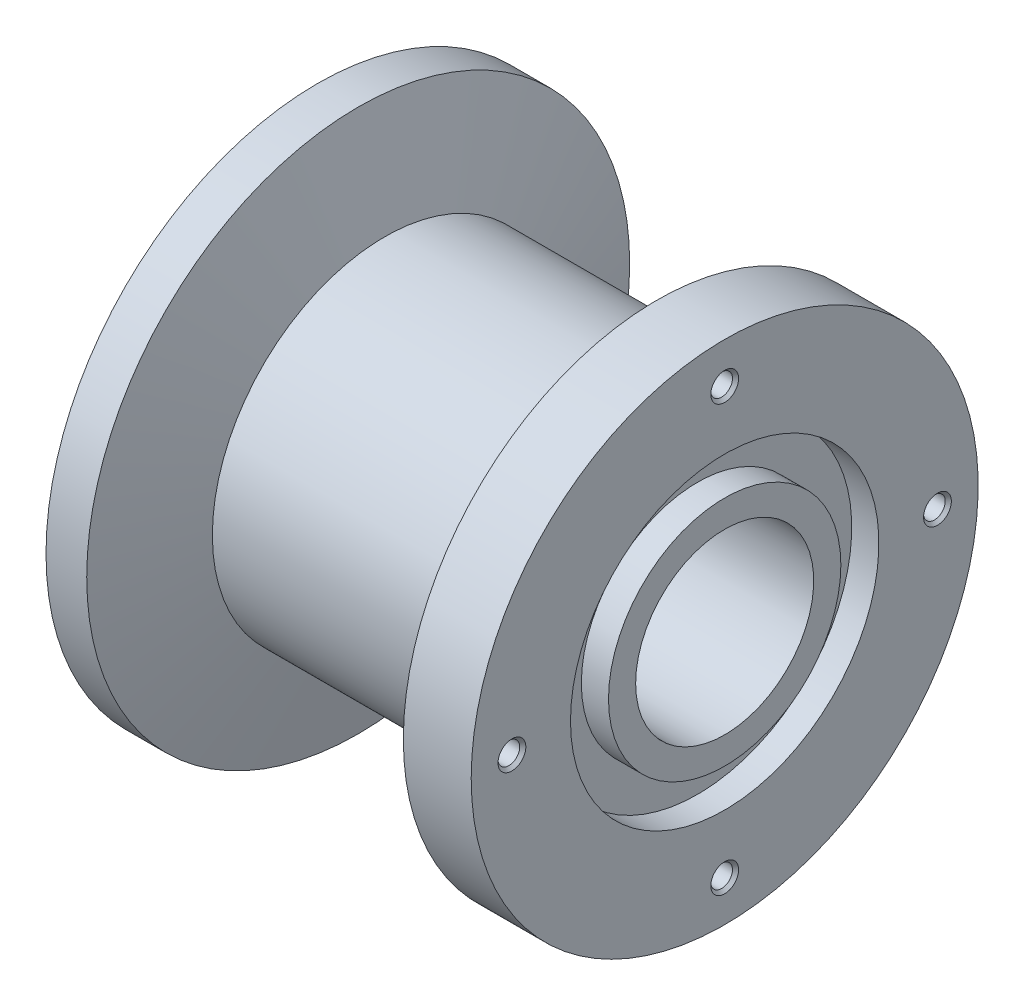
ISO-10303-21;
HEADER;
FILE_DESCRIPTION(('STEP AP214'),'2;1');
FILE_NAME('part.step','',(''),(''),'','','');
FILE_SCHEMA(('AUTOMOTIVE_DESIGN { 1 0 10303 214 1 1 1 1 }'));
ENDSEC;
DATA;
#1=APPLICATION_CONTEXT('core data for automotive mechanical design processes');
#2=APPLICATION_PROTOCOL_DEFINITION('international standard','automotive_design',2000,#1);
#3=PRODUCT_CONTEXT('',#1,'mechanical');
#4=PRODUCT('Part','Part','',(#3));
#5=PRODUCT_RELATED_PRODUCT_CATEGORY('part','',(#4));
#6=PRODUCT_DEFINITION_FORMATION('','',#4);
#7=PRODUCT_DEFINITION_CONTEXT('part definition',#1,'design');
#8=PRODUCT_DEFINITION('design','',#6,#7);
#9=PRODUCT_DEFINITION_SHAPE('','',#8);
#10=(LENGTH_UNIT() NAMED_UNIT(*) SI_UNIT(.MILLI.,.METRE.));
#11=(NAMED_UNIT(*) PLANE_ANGLE_UNIT() SI_UNIT($,.RADIAN.));
#12=(NAMED_UNIT(*) SI_UNIT($,.STERADIAN.) SOLID_ANGLE_UNIT());
#13=UNCERTAINTY_MEASURE_WITH_UNIT(LENGTH_MEASURE(1.E-05),#10,'distance_accuracy_value','');
#14=(GEOMETRIC_REPRESENTATION_CONTEXT(3) GLOBAL_UNCERTAINTY_ASSIGNED_CONTEXT((#13)) GLOBAL_UNIT_ASSIGNED_CONTEXT((#10,
#11,#12)) REPRESENTATION_CONTEXT('',''));
#15=CARTESIAN_POINT('',(0.,0.,0.));
#16=DIRECTION('',(0.,0.,1.));
#17=DIRECTION('',(1.,0.,0.));
#18=AXIS2_PLACEMENT_3D('',#15,#16,#17);
#19=CARTESIAN_POINT('',(-29.0412384639782,0.,0.));
#20=DIRECTION('',(-1.,0.,0.));
#21=DIRECTION('',(0.,0.,1.));
#22=AXIS2_PLACEMENT_3D('',#19,#20,#21);
#23=CYLINDRICAL_SURFACE('',#22,20.);
#24=CARTESIAN_POINT('',(0.,0.,0.));
#25=DIRECTION('',(-1.,0.,0.));
#26=DIRECTION('',(0.,0.,1.));
#27=AXIS2_PLACEMENT_3D('',#24,#25,#26);
#28=CIRCLE('',#27,20.);
#29=CARTESIAN_POINT('',(0.,0.,20.));
#30=VERTEX_POINT('',#29);
#31=EDGE_CURVE('E10',#30,#30,#28,.T.);
#32=ORIENTED_EDGE('',*,*,#31,.F.);
#33=EDGE_LOOP('',(#32));
#34=FACE_BOUND('',#33,.T.);
#35=CARTESIAN_POINT('',(3.,0.,0.));
#36=DIRECTION('',(-1.,0.,0.));
#37=DIRECTION('',(0.,0.,1.));
#38=AXIS2_PLACEMENT_3D('',#35,#36,#37);
#39=CIRCLE('',#38,20.);
#40=CARTESIAN_POINT('',(3.,0.,20.));
#41=VERTEX_POINT('',#40);
#42=EDGE_CURVE('E83',#41,#41,#39,.T.);
#43=ORIENTED_EDGE('',*,*,#42,.T.);
#44=EDGE_LOOP('',(#43));
#45=FACE_BOUND('',#44,.T.);
#46=ADVANCED_FACE('F37',(#34,#45),#23,.T.);
#47=CARTESIAN_POINT('',(0.,20.,0.));
#48=DIRECTION('',(1.,0.,0.));
#49=DIRECTION('',(0.,0.,-1.));
#50=AXIS2_PLACEMENT_3D('',#47,#48,#49);
#51=PLANE('',#50);
#52=CARTESIAN_POINT('',(0.,0.,0.));
#53=DIRECTION('',(-1.,0.,0.));
#54=DIRECTION('',(0.,0.,1.));
#55=AXIS2_PLACEMENT_3D('',#52,#53,#54);
#56=CIRCLE('',#55,13.2);
#57=CARTESIAN_POINT('',(0.,0.,13.2));
#58=VERTEX_POINT('',#57);
#59=EDGE_CURVE('E43',#58,#58,#56,.T.);
#60=ORIENTED_EDGE('',*,*,#59,.F.);
#61=EDGE_LOOP('',(#60));
#62=FACE_BOUND('',#61,.T.);
#63=ORIENTED_EDGE('',*,*,#31,.T.);
#64=EDGE_LOOP('',(#63));
#65=FACE_BOUND('',#64,.T.);
#66=ADVANCED_FACE('F178',(#62,#65),#51,.F.);
#67=CARTESIAN_POINT('',(-29.0412384639782,0.,0.));
#68=DIRECTION('',(-1.,0.,0.));
#69=DIRECTION('',(0.,0.,1.));
#70=AXIS2_PLACEMENT_3D('',#67,#68,#69);
#71=CYLINDRICAL_SURFACE('',#70,13.2);
#72=CARTESIAN_POINT('',(2.7,0.,0.));
#73=DIRECTION('',(-1.,0.,0.));
#74=DIRECTION('',(0.,0.,1.));
#75=AXIS2_PLACEMENT_3D('',#72,#73,#74);
#76=CIRCLE('',#75,13.2);
#77=CARTESIAN_POINT('',(2.7,0.,13.2));
#78=VERTEX_POINT('',#77);
#79=EDGE_CURVE('E47',#78,#78,#76,.T.);
#80=ORIENTED_EDGE('',*,*,#79,.F.);
#81=EDGE_LOOP('',(#80));
#82=FACE_BOUND('',#81,.T.);
#83=ORIENTED_EDGE('',*,*,#59,.T.);
#84=EDGE_LOOP('',(#83));
#85=FACE_BOUND('',#84,.T.);
#86=ADVANCED_FACE('F173',(#82,#85),#71,.F.);
#87=CARTESIAN_POINT('',(2.7,13.2,0.));
#88=DIRECTION('',(1.,0.,0.));
#89=DIRECTION('',(0.,0.,-1.));
#90=AXIS2_PLACEMENT_3D('',#87,#88,#89);
#91=PLANE('',#90);
#92=CARTESIAN_POINT('',(2.7,0.,0.));
#93=DIRECTION('',(-1.,0.,0.));
#94=DIRECTION('',(0.,0.,1.));
#95=AXIS2_PLACEMENT_3D('',#92,#93,#94);
#96=CIRCLE('',#95,6.56);
#97=CARTESIAN_POINT('',(2.7,0.,6.56));
#98=VERTEX_POINT('',#97);
#99=EDGE_CURVE('E51',#98,#98,#96,.T.);
#100=ORIENTED_EDGE('',*,*,#99,.F.);
#101=EDGE_LOOP('',(#100));
#102=FACE_BOUND('',#101,.T.);
#103=ORIENTED_EDGE('',*,*,#79,.T.);
#104=EDGE_LOOP('',(#103));
#105=FACE_BOUND('',#104,.T.);
#106=ADVANCED_FACE('F167',(#102,#105),#91,.F.);
#107=CARTESIAN_POINT('',(-29.0412384639782,0.,0.));
#108=DIRECTION('',(-1.,0.,0.));
#109=DIRECTION('',(0.,0.,1.));
#110=AXIS2_PLACEMENT_3D('',#107,#108,#109);
#111=CYLINDRICAL_SURFACE('',#110,6.56);
#112=CARTESIAN_POINT('',(30.,0.,0.));
#113=DIRECTION('',(-1.,0.,0.));
#114=DIRECTION('',(0.,0.,1.));
#115=AXIS2_PLACEMENT_3D('',#112,#113,#114);
#116=CIRCLE('',#115,6.56);
#117=CARTESIAN_POINT('',(30.,0.,6.56));
#118=VERTEX_POINT('',#117);
#119=EDGE_CURVE('E56',#118,#118,#116,.T.);
#120=ORIENTED_EDGE('',*,*,#119,.F.);
#121=EDGE_LOOP('',(#120));
#122=FACE_BOUND('',#121,.T.);
#123=ORIENTED_EDGE('',*,*,#99,.T.);
#124=EDGE_LOOP('',(#123));
#125=FACE_BOUND('',#124,.T.);
#126=ADVANCED_FACE('F161',(#122,#125),#111,.F.);
#127=CARTESIAN_POINT('',(30.,6.56,0.));
#128=DIRECTION('',(-1.,0.,0.));
#129=DIRECTION('',(0.,0.,1.));
#130=AXIS2_PLACEMENT_3D('',#127,#128,#129);
#131=PLANE('',#130);
#132=CARTESIAN_POINT('',(30.,0.,0.));
#133=DIRECTION('',(-1.,0.,0.));
#134=DIRECTION('',(0.,0.,1.));
#135=AXIS2_PLACEMENT_3D('',#132,#133,#134);
#136=CIRCLE('',#135,8.56);
#137=CARTESIAN_POINT('',(30.,0.,8.56));
#138=VERTEX_POINT('',#137);
#139=EDGE_CURVE('E59',#138,#138,#136,.T.);
#140=ORIENTED_EDGE('',*,*,#139,.F.);
#141=EDGE_LOOP('',(#140));
#142=FACE_BOUND('',#141,.T.);
#143=ORIENTED_EDGE('',*,*,#119,.T.);
#144=EDGE_LOOP('',(#143));
#145=FACE_BOUND('',#144,.T.);
#146=ADVANCED_FACE('F155',(#142,#145),#131,.F.);
#147=CARTESIAN_POINT('',(-29.0412384639782,0.,0.));
#148=DIRECTION('',(-1.,0.,0.));
#149=DIRECTION('',(0.,0.,1.));
#150=AXIS2_PLACEMENT_3D('',#147,#148,#149);
#151=CYLINDRICAL_SURFACE('',#150,8.56);
#152=CARTESIAN_POINT('',(28.,0.,0.));
#153=DIRECTION('',(-1.,0.,0.));
#154=DIRECTION('',(0.,0.,1.));
#155=AXIS2_PLACEMENT_3D('',#152,#153,#154);
#156=CIRCLE('',#155,8.56);
#157=CARTESIAN_POINT('',(28.,0.,8.56));
#158=VERTEX_POINT('',#157);
#159=EDGE_CURVE('E62',#158,#158,#156,.T.);
#160=ORIENTED_EDGE('',*,*,#159,.F.);
#161=EDGE_LOOP('',(#160));
#162=FACE_BOUND('',#161,.T.);
#163=ORIENTED_EDGE('',*,*,#139,.T.);
#164=EDGE_LOOP('',(#163));
#165=FACE_BOUND('',#164,.T.);
#166=ADVANCED_FACE('F149',(#162,#165),#151,.T.);
#167=CARTESIAN_POINT('',(28.,8.56,0.));
#168=DIRECTION('',(-1.,0.,0.));
#169=DIRECTION('',(0.,0.,1.));
#170=AXIS2_PLACEMENT_3D('',#167,#168,#169);
#171=PLANE('',#170);
#172=CARTESIAN_POINT('',(28.,0.,0.));
#173=DIRECTION('',(-1.,0.,0.));
#174=DIRECTION('',(0.,0.,1.));
#175=AXIS2_PLACEMENT_3D('',#172,#173,#174);
#176=CIRCLE('',#175,11.36);
#177=CARTESIAN_POINT('',(28.,0.,11.36));
#178=VERTEX_POINT('',#177);
#179=EDGE_CURVE('E65',#178,#178,#176,.T.);
#180=ORIENTED_EDGE('',*,*,#179,.F.);
#181=EDGE_LOOP('',(#180));
#182=FACE_BOUND('',#181,.T.);
#183=ORIENTED_EDGE('',*,*,#159,.T.);
#184=EDGE_LOOP('',(#183));
#185=FACE_BOUND('',#184,.T.);
#186=ADVANCED_FACE('F143',(#182,#185),#171,.F.);
#187=CARTESIAN_POINT('',(-29.0412384639782,0.,0.));
#188=DIRECTION('',(-1.,0.,0.));
#189=DIRECTION('',(0.,0.,1.));
#190=AXIS2_PLACEMENT_3D('',#187,#188,#189);
#191=CYLINDRICAL_SURFACE('',#190,11.36);
#192=CARTESIAN_POINT('',(30.,0.,0.));
#193=DIRECTION('',(-1.,0.,0.));
#194=DIRECTION('',(0.,0.,1.));
#195=AXIS2_PLACEMENT_3D('',#192,#193,#194);
#196=CIRCLE('',#195,11.36);
#197=CARTESIAN_POINT('',(30.,0.,11.36));
#198=VERTEX_POINT('',#197);
#199=EDGE_CURVE('E68',#198,#198,#196,.T.);
#200=ORIENTED_EDGE('',*,*,#199,.F.);
#201=EDGE_LOOP('',(#200));
#202=FACE_BOUND('',#201,.T.);
#203=ORIENTED_EDGE('',*,*,#179,.T.);
#204=EDGE_LOOP('',(#203));
#205=FACE_BOUND('',#204,.T.);
#206=ADVANCED_FACE('F129',(#202,#205),#191,.F.);
#207=CARTESIAN_POINT('',(30.,11.36,0.));
#208=DIRECTION('',(-1.,0.,0.));
#209=DIRECTION('',(0.,0.,1.));
#210=AXIS2_PLACEMENT_3D('',#207,#208,#209);
#211=PLANE('',#210);
#212=CARTESIAN_POINT('',(30.,-15.675,0.));
#213=DIRECTION('',(1.,0.,0.));
#214=DIRECTION('',(0.,0.,1.));
#215=AXIS2_PLACEMENT_3D('',#212,#213,#214);
#216=CIRCLE('',#215,1.025);
#217=CARTESIAN_POINT('',(30.,-15.675,1.025));
#218=VERTEX_POINT('',#217);
#219=EDGE_CURVE('E108',#218,#218,#216,.T.);
#220=ORIENTED_EDGE('',*,*,#219,.F.);
#221=EDGE_LOOP('',(#220));
#222=FACE_BOUND('',#221,.T.);
#223=CARTESIAN_POINT('',(30.,1.64186909959098E-13,-15.675));
#224=DIRECTION('',(1.,0.,0.));
#225=DIRECTION('',(0.,-1.,0.));
#226=AXIS2_PLACEMENT_3D('',#223,#224,#225);
#227=CIRCLE('',#226,1.025);
#228=CARTESIAN_POINT('',(30.,-1.02499999999983,-15.675));
#229=VERTEX_POINT('',#228);
#230=EDGE_CURVE('E112',#229,#229,#227,.T.);
#231=ORIENTED_EDGE('',*,*,#230,.F.);
#232=EDGE_LOOP('',(#231));
#233=FACE_BOUND('',#232,.T.);
#234=CARTESIAN_POINT('',(30.,0.,15.675));
#235=DIRECTION('',(1.,0.,0.));
#236=DIRECTION('',(0.,1.,0.));
#237=AXIS2_PLACEMENT_3D('',#234,#235,#236);
#238=CIRCLE('',#237,1.025);
#239=CARTESIAN_POINT('',(30.,1.02499999999994,15.675));
#240=VERTEX_POINT('',#239);
#241=EDGE_CURVE('E101',#240,#240,#238,.T.);
#242=ORIENTED_EDGE('',*,*,#241,.F.);
#243=EDGE_LOOP('',(#242));
#244=FACE_BOUND('',#243,.T.);
#245=CARTESIAN_POINT('',(30.,15.675,0.));
#246=DIRECTION('',(1.,0.,0.));
#247=DIRECTION('',(0.,0.,-1.));
#248=AXIS2_PLACEMENT_3D('',#245,#246,#247);
#249=CIRCLE('',#248,1.025);
#250=CARTESIAN_POINT('',(30.,15.675,-1.025));
#251=VERTEX_POINT('',#250);
#252=EDGE_CURVE('E92',#251,#251,#249,.T.);
#253=ORIENTED_EDGE('',*,*,#252,.F.);
#254=EDGE_LOOP('',(#253));
#255=FACE_BOUND('',#254,.T.);
#256=CARTESIAN_POINT('',(30.,0.,0.));
#257=DIRECTION('',(-1.,0.,0.));
#258=DIRECTION('',(0.,0.,1.));
#259=AXIS2_PLACEMENT_3D('',#256,#257,#258);
#260=CIRCLE('',#259,18.675);
#261=CARTESIAN_POINT('',(30.,0.,18.675));
#262=VERTEX_POINT('',#261);
#263=EDGE_CURVE('E71',#262,#262,#260,.T.);
#264=ORIENTED_EDGE('',*,*,#263,.F.);
#265=EDGE_LOOP('',(#264));
#266=FACE_BOUND('',#265,.T.);
#267=ORIENTED_EDGE('',*,*,#199,.T.);
#268=EDGE_LOOP('',(#267));
#269=FACE_BOUND('',#268,.T.);
#270=ADVANCED_FACE('F125',(#222,#233,#244,#255,#266,#269),#211,.F.);
#271=CARTESIAN_POINT('',(-29.0412384639782,0.,0.));
#272=DIRECTION('',(-1.,0.,0.));
#273=DIRECTION('',(0.,0.,1.));
#274=AXIS2_PLACEMENT_3D('',#271,#272,#273);
#275=CYLINDRICAL_SURFACE('',#274,18.675);
#276=CARTESIAN_POINT('',(25.,0.,0.));
#277=DIRECTION('',(-1.,0.,0.));
#278=DIRECTION('',(0.,0.,1.));
#279=AXIS2_PLACEMENT_3D('',#276,#277,#278);
#280=CIRCLE('',#279,18.675);
#281=CARTESIAN_POINT('',(25.,0.,18.675));
#282=VERTEX_POINT('',#281);
#283=EDGE_CURVE('E74',#282,#282,#280,.T.);
#284=ORIENTED_EDGE('',*,*,#283,.F.);
#285=EDGE_LOOP('',(#284));
#286=FACE_BOUND('',#285,.T.);
#287=ORIENTED_EDGE('',*,*,#263,.T.);
#288=EDGE_LOOP('',(#287));
#289=FACE_BOUND('',#288,.T.);
#290=ADVANCED_FACE('F128',(#286,#289),#275,.T.);
#291=CARTESIAN_POINT('',(25.,18.675,0.));
#292=DIRECTION('',(1.,0.,0.));
#293=DIRECTION('',(0.,0.,-1.));
#294=AXIS2_PLACEMENT_3D('',#291,#292,#293);
#295=PLANE('',#294);
#296=CARTESIAN_POINT('',(25.,-15.675,0.));
#297=DIRECTION('',(1.,0.,0.));
#298=DIRECTION('',(0.,0.,1.));
#299=AXIS2_PLACEMENT_3D('',#296,#297,#298);
#300=CIRCLE('',#299,0.799999999999999);
#301=CARTESIAN_POINT('',(25.,-15.675,0.799999999999999));
#302=VERTEX_POINT('',#301);
#303=EDGE_CURVE('E117',#302,#302,#300,.T.);
#304=ORIENTED_EDGE('',*,*,#303,.T.);
#305=EDGE_LOOP('',(#304));
#306=FACE_BOUND('',#305,.T.);
#307=CARTESIAN_POINT('',(25.,1.64186909959098E-13,-15.675));
#308=DIRECTION('',(1.,0.,0.));
#309=DIRECTION('',(0.,-1.,0.));
#310=AXIS2_PLACEMENT_3D('',#307,#308,#309);
#311=CIRCLE('',#310,0.799999999999999);
#312=CARTESIAN_POINT('',(25.,-0.799999999999835,-15.675));
#313=VERTEX_POINT('',#312);
#314=EDGE_CURVE('E109',#313,#313,#311,.T.);
#315=ORIENTED_EDGE('',*,*,#314,.T.);
#316=EDGE_LOOP('',(#315));
#317=FACE_BOUND('',#316,.T.);
#318=CARTESIAN_POINT('',(25.,0.,15.675));
#319=DIRECTION('',(1.,0.,0.));
#320=DIRECTION('',(0.,1.,0.));
#321=AXIS2_PLACEMENT_3D('',#318,#319,#320);
#322=CIRCLE('',#321,0.799999999999999);
#323=CARTESIAN_POINT('',(25.,0.799999999999944,15.675));
#324=VERTEX_POINT('',#323);
#325=EDGE_CURVE('E98',#324,#324,#322,.T.);
#326=ORIENTED_EDGE('',*,*,#325,.T.);
#327=EDGE_LOOP('',(#326));
#328=FACE_BOUND('',#327,.T.);
#329=CARTESIAN_POINT('',(25.,15.675,0.));
#330=DIRECTION('',(1.,0.,0.));
#331=DIRECTION('',(0.,0.,-1.));
#332=AXIS2_PLACEMENT_3D('',#329,#330,#331);
#333=CIRCLE('',#332,0.799999999999999);
#334=CARTESIAN_POINT('',(25.,15.675,-0.799999999999999));
#335=VERTEX_POINT('',#334);
#336=EDGE_CURVE('E86',#335,#335,#333,.T.);
#337=ORIENTED_EDGE('',*,*,#336,.T.);
#338=EDGE_LOOP('',(#337));
#339=FACE_BOUND('',#338,.T.);
#340=CARTESIAN_POINT('',(25.,0.,0.));
#341=DIRECTION('',(-1.,0.,0.));
#342=DIRECTION('',(0.,0.,1.));
#343=AXIS2_PLACEMENT_3D('',#340,#341,#342);
#344=CIRCLE('',#343,12.7);
#345=CARTESIAN_POINT('',(25.,0.,12.7));
#346=VERTEX_POINT('',#345);
#347=EDGE_CURVE('E77',#346,#346,#344,.T.);
#348=ORIENTED_EDGE('',*,*,#347,.F.);
#349=EDGE_LOOP('',(#348));
#350=FACE_BOUND('',#349,.T.);
#351=ORIENTED_EDGE('',*,*,#283,.T.);
#352=EDGE_LOOP('',(#351));
#353=FACE_BOUND('',#352,.T.);
#354=ADVANCED_FACE('F201',(#306,#317,#328,#339,#350,#353),#295,.F.);
#355=CARTESIAN_POINT('',(-29.0412384639782,0.,0.));
#356=DIRECTION('',(-1.,0.,0.));
#357=DIRECTION('',(0.,0.,1.));
#358=AXIS2_PLACEMENT_3D('',#355,#356,#357);
#359=CYLINDRICAL_SURFACE('',#358,12.7);
#360=CARTESIAN_POINT('',(4.95602910474715,0.,0.));
#361=DIRECTION('',(-1.,0.,0.));
#362=DIRECTION('',(0.,0.,1.));
#363=AXIS2_PLACEMENT_3D('',#360,#361,#362);
#364=CIRCLE('',#363,12.7);
#365=CARTESIAN_POINT('',(4.95602910474715,0.,12.7));
#366=VERTEX_POINT('',#365);
#367=EDGE_CURVE('E80',#366,#366,#364,.T.);
#368=ORIENTED_EDGE('',*,*,#367,.F.);
#369=EDGE_LOOP('',(#368));
#370=FACE_BOUND('',#369,.T.);
#371=ORIENTED_EDGE('',*,*,#347,.T.);
#372=EDGE_LOOP('',(#371));
#373=FACE_BOUND('',#372,.T.);
#374=ADVANCED_FACE('F195',(#370,#373),#359,.T.);
#375=CARTESIAN_POINT('',(4.95602910474715,0.,0.));
#376=DIRECTION('',(-1.,0.,0.));
#377=DIRECTION('',(0.,0.,1.));
#378=AXIS2_PLACEMENT_3D('',#375,#376,#377);
#379=CONICAL_SURFACE('',#378,12.7,1.30899693899575);
#380=ORIENTED_EDGE('',*,*,#42,.F.);
#381=EDGE_LOOP('',(#380));
#382=FACE_BOUND('',#381,.T.);
#383=ORIENTED_EDGE('',*,*,#367,.T.);
#384=EDGE_LOOP('',(#383));
#385=FACE_BOUND('',#384,.T.);
#386=ADVANCED_FACE('F191',(#382,#385),#379,.T.);
#387=CARTESIAN_POINT('',(30.,15.675,0.));
#388=DIRECTION('',(1.,0.,0.));
#389=DIRECTION('',(0.,0.,-1.));
#390=AXIS2_PLACEMENT_3D('',#387,#388,#389);
#391=CYLINDRICAL_SURFACE('',#390,0.799999999999999);
#392=ORIENTED_EDGE('',*,*,#336,.F.);
#393=EDGE_LOOP('',(#392));
#394=FACE_BOUND('',#393,.T.);
#395=CARTESIAN_POINT('',(29.775,15.675,0.));
#396=DIRECTION('',(1.,0.,0.));
#397=DIRECTION('',(0.,0.,-1.));
#398=AXIS2_PLACEMENT_3D('',#395,#396,#397);
#399=CIRCLE('',#398,0.799999999999999);
#400=CARTESIAN_POINT('',(29.775,15.675,-0.799999999999999));
#401=VERTEX_POINT('',#400);
#402=EDGE_CURVE('E89',#401,#401,#399,.T.);
#403=ORIENTED_EDGE('',*,*,#402,.T.);
#404=EDGE_LOOP('',(#403));
#405=FACE_BOUND('',#404,.T.);
#406=ADVANCED_FACE('F194',(#394,#405),#391,.F.);
#407=CARTESIAN_POINT('',(30.,15.675,0.));
#408=DIRECTION('',(1.,0.,0.));
#409=DIRECTION('',(0.,0.,-1.));
#410=AXIS2_PLACEMENT_3D('',#407,#408,#409);
#411=CONICAL_SURFACE('',#410,1.025,0.785398163397448);
#412=ORIENTED_EDGE('',*,*,#402,.F.);
#413=EDGE_LOOP('',(#412));
#414=FACE_BOUND('',#413,.T.);
#415=ORIENTED_EDGE('',*,*,#252,.T.);
#416=EDGE_LOOP('',(#415));
#417=FACE_BOUND('',#416,.T.);
#418=ADVANCED_FACE('F219',(#414,#417),#411,.F.);
#419=CARTESIAN_POINT('',(30.,0.,15.675));
#420=DIRECTION('',(1.,0.,0.));
#421=DIRECTION('',(0.,1.,0.));
#422=AXIS2_PLACEMENT_3D('',#419,#420,#421);
#423=CYLINDRICAL_SURFACE('',#422,0.799999999999999);
#424=ORIENTED_EDGE('',*,*,#325,.F.);
#425=EDGE_LOOP('',(#424));
#426=FACE_BOUND('',#425,.T.);
#427=CARTESIAN_POINT('',(29.775,0.,15.675));
#428=DIRECTION('',(1.,0.,0.));
#429=DIRECTION('',(0.,1.,0.));
#430=AXIS2_PLACEMENT_3D('',#427,#428,#429);
#431=CIRCLE('',#430,0.799999999999999);
#432=CARTESIAN_POINT('',(29.775,0.799999999999944,15.675));
#433=VERTEX_POINT('',#432);
#434=EDGE_CURVE('E95',#433,#433,#431,.T.);
#435=ORIENTED_EDGE('',*,*,#434,.T.);
#436=EDGE_LOOP('',(#435));
#437=FACE_BOUND('',#436,.T.);
#438=ADVANCED_FACE('F223',(#426,#437),#423,.F.);
#439=CARTESIAN_POINT('',(30.,0.,15.675));
#440=DIRECTION('',(1.,0.,0.));
#441=DIRECTION('',(0.,1.,0.));
#442=AXIS2_PLACEMENT_3D('',#439,#440,#441);
#443=CONICAL_SURFACE('',#442,1.025,0.785398163397448);
#444=ORIENTED_EDGE('',*,*,#434,.F.);
#445=EDGE_LOOP('',(#444));
#446=FACE_BOUND('',#445,.T.);
#447=ORIENTED_EDGE('',*,*,#241,.T.);
#448=EDGE_LOOP('',(#447));
#449=FACE_BOUND('',#448,.T.);
#450=ADVANCED_FACE('F227',(#446,#449),#443,.F.);
#451=CARTESIAN_POINT('',(30.,1.64186909959098E-13,-15.675));
#452=DIRECTION('',(1.,0.,0.));
#453=DIRECTION('',(0.,-1.,0.));
#454=AXIS2_PLACEMENT_3D('',#451,#452,#453);
#455=CYLINDRICAL_SURFACE('',#454,0.799999999999999);
#456=ORIENTED_EDGE('',*,*,#314,.F.);
#457=EDGE_LOOP('',(#456));
#458=FACE_BOUND('',#457,.T.);
#459=CARTESIAN_POINT('',(29.775,1.64186909959098E-13,-15.675));
#460=DIRECTION('',(1.,0.,0.));
#461=DIRECTION('',(0.,-1.,0.));
#462=AXIS2_PLACEMENT_3D('',#459,#460,#461);
#463=CIRCLE('',#462,0.799999999999999);
#464=CARTESIAN_POINT('',(29.775,-0.799999999999835,-15.675));
#465=VERTEX_POINT('',#464);
#466=EDGE_CURVE('E105',#465,#465,#463,.T.);
#467=ORIENTED_EDGE('',*,*,#466,.T.);
#468=EDGE_LOOP('',(#467));
#469=FACE_BOUND('',#468,.T.);
#470=ADVANCED_FACE('F231',(#458,#469),#455,.F.);
#471=CARTESIAN_POINT('',(30.,1.64186909959098E-13,-15.675));
#472=DIRECTION('',(1.,0.,0.));
#473=DIRECTION('',(0.,-1.,0.));
#474=AXIS2_PLACEMENT_3D('',#471,#472,#473);
#475=CONICAL_SURFACE('',#474,1.025,0.785398163397448);
#476=ORIENTED_EDGE('',*,*,#466,.F.);
#477=EDGE_LOOP('',(#476));
#478=FACE_BOUND('',#477,.T.);
#479=ORIENTED_EDGE('',*,*,#230,.T.);
#480=EDGE_LOOP('',(#479));
#481=FACE_BOUND('',#480,.T.);
#482=ADVANCED_FACE('F235',(#478,#481),#475,.F.);
#483=CARTESIAN_POINT('',(30.,-15.675,0.));
#484=DIRECTION('',(1.,0.,0.));
#485=DIRECTION('',(0.,0.,1.));
#486=AXIS2_PLACEMENT_3D('',#483,#484,#485);
#487=CYLINDRICAL_SURFACE('',#486,0.799999999999999);
#488=ORIENTED_EDGE('',*,*,#303,.F.);
#489=EDGE_LOOP('',(#488));
#490=FACE_BOUND('',#489,.T.);
#491=CARTESIAN_POINT('',(29.775,-15.675,0.));
#492=DIRECTION('',(1.,0.,0.));
#493=DIRECTION('',(0.,0.,1.));
#494=AXIS2_PLACEMENT_3D('',#491,#492,#493);
#495=CIRCLE('',#494,0.799999999999999);
#496=CARTESIAN_POINT('',(29.775,-15.675,0.799999999999999));
#497=VERTEX_POINT('',#496);
#498=EDGE_CURVE('E104',#497,#497,#495,.T.);
#499=ORIENTED_EDGE('',*,*,#498,.T.);
#500=EDGE_LOOP('',(#499));
#501=FACE_BOUND('',#500,.T.);
#502=ADVANCED_FACE('F239',(#490,#501),#487,.F.);
#503=CARTESIAN_POINT('',(30.,-15.675,0.));
#504=DIRECTION('',(1.,0.,0.));
#505=DIRECTION('',(0.,0.,1.));
#506=AXIS2_PLACEMENT_3D('',#503,#504,#505);
#507=CONICAL_SURFACE('',#506,1.025,0.785398163397448);
#508=ORIENTED_EDGE('',*,*,#498,.F.);
#509=EDGE_LOOP('',(#508));
#510=FACE_BOUND('',#509,.T.);
#511=ORIENTED_EDGE('',*,*,#219,.T.);
#512=EDGE_LOOP('',(#511));
#513=FACE_BOUND('',#512,.T.);
#514=ADVANCED_FACE('F123',(#510,#513),#507,.F.);
#515=CLOSED_SHELL('',(#46,#66,#86,#106,#126,#146,#166,#186,#206,#270,#290,#354,#374,#386,#406,
#418,#438,#450,#470,#482,#502,#514));
#516=MANIFOLD_SOLID_BREP('B2',#515);
#517=ADVANCED_BREP_SHAPE_REPRESENTATION('',(#18,#516),#14);
#518=SHAPE_DEFINITION_REPRESENTATION(#9,#517);
ENDSEC;
END-ISO-10303-21;
